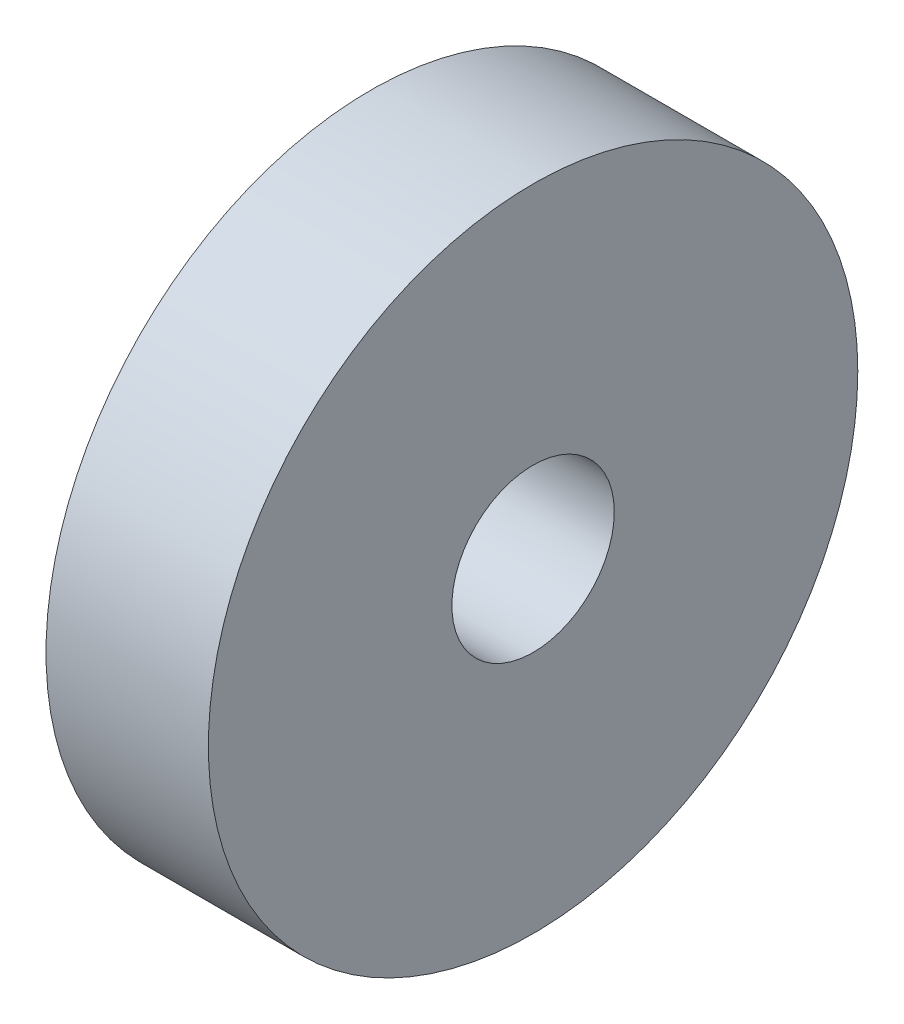
ISO-10303-21;
HEADER;
FILE_DESCRIPTION(('STEP AP214'),'2;1');
FILE_NAME('part.step','',(''),(''),'','','');
FILE_SCHEMA(('AUTOMOTIVE_DESIGN { 1 0 10303 214 1 1 1 1 }'));
ENDSEC;
DATA;
#1=APPLICATION_CONTEXT('core data for automotive mechanical design processes');
#2=APPLICATION_PROTOCOL_DEFINITION('international standard','automotive_design',2000,#1);
#3=PRODUCT_CONTEXT('',#1,'mechanical');
#4=PRODUCT('Part','Part','',(#3));
#5=PRODUCT_RELATED_PRODUCT_CATEGORY('part','',(#4));
#6=PRODUCT_DEFINITION_FORMATION('','',#4);
#7=PRODUCT_DEFINITION_CONTEXT('part definition',#1,'design');
#8=PRODUCT_DEFINITION('design','',#6,#7);
#9=PRODUCT_DEFINITION_SHAPE('','',#8);
#10=(LENGTH_UNIT() NAMED_UNIT(*) SI_UNIT(.MILLI.,.METRE.));
#11=(NAMED_UNIT(*) PLANE_ANGLE_UNIT() SI_UNIT($,.RADIAN.));
#12=(NAMED_UNIT(*) SI_UNIT($,.STERADIAN.) SOLID_ANGLE_UNIT());
#13=UNCERTAINTY_MEASURE_WITH_UNIT(LENGTH_MEASURE(1.E-05),#10,'distance_accuracy_value','');
#14=(GEOMETRIC_REPRESENTATION_CONTEXT(3) GLOBAL_UNCERTAINTY_ASSIGNED_CONTEXT((#13)) GLOBAL_UNIT_ASSIGNED_CONTEXT((#10,
#11,#12)) REPRESENTATION_CONTEXT('',''));
#15=CARTESIAN_POINT('',(0.,0.,0.));
#16=DIRECTION('',(0.,0.,1.));
#17=DIRECTION('',(1.,0.,0.));
#18=AXIS2_PLACEMENT_3D('',#15,#16,#17);
#19=CARTESIAN_POINT('',(50.,0.,0.));
#20=DIRECTION('',(1.,0.,0.));
#21=DIRECTION('',(0.,0.,-1.));
#22=AXIS2_PLACEMENT_3D('',#19,#20,#21);
#23=PLANE('',#22);
#24=CARTESIAN_POINT('',(50.,0.,0.));
#25=DIRECTION('',(1.,0.,0.));
#26=DIRECTION('',(0.,0.,-1.));
#27=AXIS2_PLACEMENT_3D('',#24,#25,#26);
#28=CIRCLE('',#27,100.);
#29=CARTESIAN_POINT('',(50.,0.,-100.));
#30=VERTEX_POINT('',#29);
#31=EDGE_CURVE('E10',#30,#30,#28,.T.);
#32=ORIENTED_EDGE('',*,*,#31,.T.);
#33=EDGE_LOOP('',(#32));
#34=FACE_BOUND('',#33,.T.);
#35=CARTESIAN_POINT('',(50.,0.,0.));
#36=DIRECTION('',(1.,0.,0.));
#37=DIRECTION('',(0.,0.,-1.));
#38=AXIS2_PLACEMENT_3D('',#35,#36,#37);
#39=CIRCLE('',#38,25.);
#40=CARTESIAN_POINT('',(50.,0.,-25.));
#41=VERTEX_POINT('',#40);
#42=EDGE_CURVE('E48',#41,#41,#39,.T.);
#43=ORIENTED_EDGE('',*,*,#42,.F.);
#44=EDGE_LOOP('',(#43));
#45=FACE_BOUND('',#44,.T.);
#46=ADVANCED_FACE('F37',(#34,#45),#23,.T.);
#47=CARTESIAN_POINT('',(0.,0.,0.));
#48=DIRECTION('',(1.,0.,0.));
#49=DIRECTION('',(0.,0.,-1.));
#50=AXIS2_PLACEMENT_3D('',#47,#48,#49);
#51=PLANE('',#50);
#52=CARTESIAN_POINT('',(0.,0.,0.));
#53=DIRECTION('',(1.,0.,0.));
#54=DIRECTION('',(0.,0.,-1.));
#55=AXIS2_PLACEMENT_3D('',#52,#53,#54);
#56=CIRCLE('',#55,100.);
#57=CARTESIAN_POINT('',(0.,0.,-100.));
#58=VERTEX_POINT('',#57);
#59=EDGE_CURVE('E41',#58,#58,#56,.T.);
#60=ORIENTED_EDGE('',*,*,#59,.F.);
#61=EDGE_LOOP('',(#60));
#62=FACE_BOUND('',#61,.T.);
#63=CARTESIAN_POINT('',(0.,0.,0.));
#64=DIRECTION('',(1.,0.,0.));
#65=DIRECTION('',(0.,0.,-1.));
#66=AXIS2_PLACEMENT_3D('',#63,#64,#65);
#67=CIRCLE('',#66,25.);
#68=CARTESIAN_POINT('',(0.,0.,-25.));
#69=VERTEX_POINT('',#68);
#70=EDGE_CURVE('E50',#69,#69,#67,.T.);
#71=ORIENTED_EDGE('',*,*,#70,.T.);
#72=EDGE_LOOP('',(#71));
#73=FACE_BOUND('',#72,.T.);
#74=ADVANCED_FACE('F60',(#62,#73),#51,.F.);
#75=CARTESIAN_POINT('',(50.,0.,0.));
#76=DIRECTION('',(-1.,0.,0.));
#77=DIRECTION('',(0.,0.,1.));
#78=AXIS2_PLACEMENT_3D('',#75,#76,#77);
#79=CYLINDRICAL_SURFACE('',#78,100.);
#80=ORIENTED_EDGE('',*,*,#31,.F.);
#81=EDGE_LOOP('',(#80));
#82=FACE_BOUND('',#81,.T.);
#83=ORIENTED_EDGE('',*,*,#59,.T.);
#84=EDGE_LOOP('',(#83));
#85=FACE_BOUND('',#84,.T.);
#86=ADVANCED_FACE('F39',(#82,#85),#79,.T.);
#87=CARTESIAN_POINT('',(50.,0.,0.));
#88=DIRECTION('',(-1.,0.,0.));
#89=DIRECTION('',(0.,0.,1.));
#90=AXIS2_PLACEMENT_3D('',#87,#88,#89);
#91=CYLINDRICAL_SURFACE('',#90,25.);
#92=ORIENTED_EDGE('',*,*,#42,.T.);
#93=EDGE_LOOP('',(#92));
#94=FACE_BOUND('',#93,.T.);
#95=ORIENTED_EDGE('',*,*,#70,.F.);
#96=EDGE_LOOP('',(#95));
#97=FACE_BOUND('',#96,.T.);
#98=ADVANCED_FACE('F56',(#94,#97),#91,.F.);
#99=CLOSED_SHELL('',(#46,#74,#86,#98));
#100=MANIFOLD_SOLID_BREP('B2',#99);
#101=ADVANCED_BREP_SHAPE_REPRESENTATION('',(#18,#100),#14);
#102=SHAPE_DEFINITION_REPRESENTATION(#9,#101);
ENDSEC;
END-ISO-10303-21;
